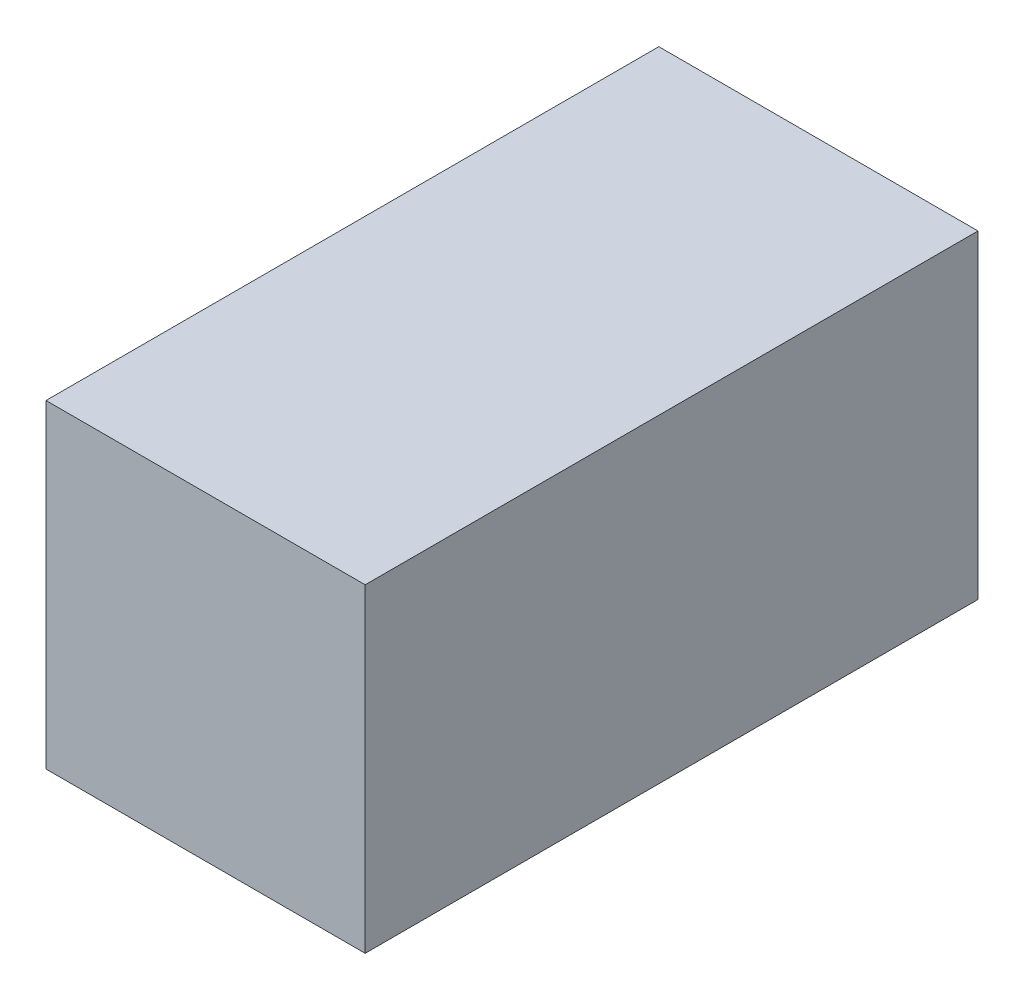
ISO-10303-21;
HEADER;
FILE_DESCRIPTION(('STEP AP214'),'2;1');
FILE_NAME('part.step','',(''),(''),'','','');
FILE_SCHEMA(('AUTOMOTIVE_DESIGN { 1 0 10303 214 1 1 1 1 }'));
ENDSEC;
DATA;
#1=APPLICATION_CONTEXT('core data for automotive mechanical design processes');
#2=APPLICATION_PROTOCOL_DEFINITION('international standard','automotive_design',2000,#1);
#3=PRODUCT_CONTEXT('',#1,'mechanical');
#4=PRODUCT('Part','Part','',(#3));
#5=PRODUCT_RELATED_PRODUCT_CATEGORY('part','',(#4));
#6=PRODUCT_DEFINITION_FORMATION('','',#4);
#7=PRODUCT_DEFINITION_CONTEXT('part definition',#1,'design');
#8=PRODUCT_DEFINITION('design','',#6,#7);
#9=PRODUCT_DEFINITION_SHAPE('','',#8);
#10=(LENGTH_UNIT() NAMED_UNIT(*) SI_UNIT(.MILLI.,.METRE.));
#11=(NAMED_UNIT(*) PLANE_ANGLE_UNIT() SI_UNIT($,.RADIAN.));
#12=(NAMED_UNIT(*) SI_UNIT($,.STERADIAN.) SOLID_ANGLE_UNIT());
#13=UNCERTAINTY_MEASURE_WITH_UNIT(LENGTH_MEASURE(1.E-05),#10,'distance_accuracy_value','');
#14=(GEOMETRIC_REPRESENTATION_CONTEXT(3) GLOBAL_UNCERTAINTY_ASSIGNED_CONTEXT((#13)) GLOBAL_UNIT_ASSIGNED_CONTEXT((#10,
#11,#12)) REPRESENTATION_CONTEXT('',''));
#15=CARTESIAN_POINT('',(0.,0.,0.));
#16=DIRECTION('',(0.,0.,1.));
#17=DIRECTION('',(1.,0.,0.));
#18=AXIS2_PLACEMENT_3D('',#15,#16,#17);
#19=CARTESIAN_POINT('',(-1.190625,1.190625,-4.572));
#20=DIRECTION('',(-1.,0.,0.));
#21=DIRECTION('',(0.,0.,1.));
#22=AXIS2_PLACEMENT_3D('',#19,#20,#21);
#23=PLANE('',#22);
#24=DIRECTION('',(0.,-1.,0.));
#25=VECTOR('',#24,1.);
#26=CARTESIAN_POINT('',(-1.190625,1.190625,0.));
#27=LINE('',#26,#25);
#28=CARTESIAN_POINT('',(-1.190625,1.190625,0.));
#29=VERTEX_POINT('',#28);
#30=CARTESIAN_POINT('',(-1.190625,-1.190625,0.));
#31=VERTEX_POINT('',#30);
#32=EDGE_CURVE('E98',#29,#31,#27,.T.);
#33=ORIENTED_EDGE('',*,*,#32,.F.);
#34=DIRECTION('',(0.,0.,1.));
#35=VECTOR('',#34,1.);
#36=CARTESIAN_POINT('',(-1.190625,1.190625,-4.572));
#37=LINE('',#36,#35);
#38=CARTESIAN_POINT('',(-1.190625,1.190625,-4.572));
#39=VERTEX_POINT('',#38);
#40=EDGE_CURVE('E11',#39,#29,#37,.T.);
#41=ORIENTED_EDGE('',*,*,#40,.F.);
#42=DIRECTION('',(0.,-1.,0.));
#43=VECTOR('',#42,1.);
#44=CARTESIAN_POINT('',(-1.190625,1.190625,-4.572));
#45=LINE('',#44,#43);
#46=CARTESIAN_POINT('',(-1.190625,-1.190625,-4.572));
#47=VERTEX_POINT('',#46);
#48=EDGE_CURVE('E92',#39,#47,#45,.T.);
#49=ORIENTED_EDGE('',*,*,#48,.T.);
#50=DIRECTION('',(0.,0.,1.));
#51=VECTOR('',#50,1.);
#52=CARTESIAN_POINT('',(-1.190625,-1.190625,-4.572));
#53=LINE('',#52,#51);
#54=EDGE_CURVE('E37',#47,#31,#53,.T.);
#55=ORIENTED_EDGE('',*,*,#54,.T.);
#56=EDGE_LOOP('',(#33,#41,#49,#55));
#57=FACE_BOUND('',#56,.T.);
#58=ADVANCED_FACE('F34',(#57),#23,.T.);
#59=CARTESIAN_POINT('',(-1.190625,1.190625,-4.572));
#60=DIRECTION('',(0.,1.,0.));
#61=DIRECTION('',(0.,0.,1.));
#62=AXIS2_PLACEMENT_3D('',#59,#60,#61);
#63=PLANE('',#62);
#64=DIRECTION('',(-1.,0.,0.));
#65=VECTOR('',#64,1.);
#66=CARTESIAN_POINT('',(-1.190625,1.190625,0.));
#67=LINE('',#66,#65);
#68=CARTESIAN_POINT('',(1.190625,1.190625,0.));
#69=VERTEX_POINT('',#68);
#70=EDGE_CURVE('E94',#69,#29,#67,.T.);
#71=ORIENTED_EDGE('',*,*,#70,.F.);
#72=DIRECTION('',(0.,0.,1.));
#73=VECTOR('',#72,1.);
#74=CARTESIAN_POINT('',(1.190625,1.190625,-4.572));
#75=LINE('',#74,#73);
#76=CARTESIAN_POINT('',(1.190625,1.190625,-4.572));
#77=VERTEX_POINT('',#76);
#78=EDGE_CURVE('E43',#77,#69,#75,.T.);
#79=ORIENTED_EDGE('',*,*,#78,.F.);
#80=DIRECTION('',(-1.,0.,0.));
#81=VECTOR('',#80,1.);
#82=CARTESIAN_POINT('',(-1.190625,1.190625,-4.572));
#83=LINE('',#82,#81);
#84=EDGE_CURVE('E89',#77,#39,#83,.T.);
#85=ORIENTED_EDGE('',*,*,#84,.T.);
#86=ORIENTED_EDGE('',*,*,#40,.T.);
#87=EDGE_LOOP('',(#71,#79,#85,#86));
#88=FACE_BOUND('',#87,.T.);
#89=ADVANCED_FACE('F108',(#88),#63,.T.);
#90=CARTESIAN_POINT('',(1.190625,1.190625,-4.572));
#91=DIRECTION('',(1.,0.,0.));
#92=DIRECTION('',(0.,1.,0.));
#93=AXIS2_PLACEMENT_3D('',#90,#91,#92);
#94=PLANE('',#93);
#95=DIRECTION('',(0.,1.,0.));
#96=VECTOR('',#95,1.);
#97=CARTESIAN_POINT('',(1.190625,1.190625,0.));
#98=LINE('',#97,#96);
#99=CARTESIAN_POINT('',(1.190625,-1.190625,0.));
#100=VERTEX_POINT('',#99);
#101=EDGE_CURVE('E84',#100,#69,#98,.T.);
#102=ORIENTED_EDGE('',*,*,#101,.F.);
#103=DIRECTION('',(0.,0.,1.));
#104=VECTOR('',#103,1.);
#105=CARTESIAN_POINT('',(1.190625,-1.190625,-4.572));
#106=LINE('',#105,#104);
#107=CARTESIAN_POINT('',(1.190625,-1.190625,-4.572));
#108=VERTEX_POINT('',#107);
#109=EDGE_CURVE('E79',#108,#100,#106,.T.);
#110=ORIENTED_EDGE('',*,*,#109,.F.);
#111=DIRECTION('',(0.,1.,0.));
#112=VECTOR('',#111,1.);
#113=CARTESIAN_POINT('',(1.190625,1.190625,-4.572));
#114=LINE('',#113,#112);
#115=EDGE_CURVE('E82',#108,#77,#114,.T.);
#116=ORIENTED_EDGE('',*,*,#115,.T.);
#117=ORIENTED_EDGE('',*,*,#78,.T.);
#118=EDGE_LOOP('',(#102,#110,#116,#117));
#119=FACE_BOUND('',#118,.T.);
#120=ADVANCED_FACE('F81',(#119),#94,.T.);
#121=CARTESIAN_POINT('',(-1.190625,-1.190625,-4.572));
#122=DIRECTION('',(0.,-1.,0.));
#123=DIRECTION('',(0.,0.,-1.));
#124=AXIS2_PLACEMENT_3D('',#121,#122,#123);
#125=PLANE('',#124);
#126=DIRECTION('',(1.,0.,0.));
#127=VECTOR('',#126,1.);
#128=CARTESIAN_POINT('',(-1.190625,-1.190625,0.));
#129=LINE('',#128,#127);
#130=EDGE_CURVE('E101',#31,#100,#129,.T.);
#131=ORIENTED_EDGE('',*,*,#130,.F.);
#132=ORIENTED_EDGE('',*,*,#54,.F.);
#133=DIRECTION('',(1.,0.,0.));
#134=VECTOR('',#133,1.);
#135=CARTESIAN_POINT('',(-1.190625,-1.190625,-4.572));
#136=LINE('',#135,#134);
#137=EDGE_CURVE('E88',#47,#108,#136,.T.);
#138=ORIENTED_EDGE('',*,*,#137,.T.);
#139=ORIENTED_EDGE('',*,*,#109,.T.);
#140=EDGE_LOOP('',(#131,#132,#138,#139));
#141=FACE_BOUND('',#140,.T.);
#142=ADVANCED_FACE('F91',(#141),#125,.T.);
#143=CARTESIAN_POINT('',(-1.190625,-1.190625,-4.572));
#144=DIRECTION('',(0.,0.,1.));
#145=DIRECTION('',(1.,0.,0.));
#146=AXIS2_PLACEMENT_3D('',#143,#144,#145);
#147=PLANE('',#146);
#148=ORIENTED_EDGE('',*,*,#48,.F.);
#149=ORIENTED_EDGE('',*,*,#84,.F.);
#150=ORIENTED_EDGE('',*,*,#115,.F.);
#151=ORIENTED_EDGE('',*,*,#137,.F.);
#152=EDGE_LOOP('',(#148,#149,#150,#151));
#153=FACE_BOUND('',#152,.T.);
#154=ADVANCED_FACE('F87',(#153),#147,.F.);
#155=CARTESIAN_POINT('',(-1.190625,-1.190625,0.));
#156=DIRECTION('',(0.,0.,1.));
#157=DIRECTION('',(1.,0.,0.));
#158=AXIS2_PLACEMENT_3D('',#155,#156,#157);
#159=PLANE('',#158);
#160=ORIENTED_EDGE('',*,*,#32,.T.);
#161=ORIENTED_EDGE('',*,*,#130,.T.);
#162=ORIENTED_EDGE('',*,*,#101,.T.);
#163=ORIENTED_EDGE('',*,*,#70,.T.);
#164=EDGE_LOOP('',(#160,#161,#162,#163));
#165=FACE_BOUND('',#164,.T.);
#166=ADVANCED_FACE('F107',(#165),#159,.T.);
#167=CLOSED_SHELL('',(#58,#89,#120,#142,#154,#166));
#168=MANIFOLD_SOLID_BREP('B2',#167);
#169=ADVANCED_BREP_SHAPE_REPRESENTATION('',(#18,#168),#14);
#170=SHAPE_DEFINITION_REPRESENTATION(#9,#169);
ENDSEC;
END-ISO-10303-21;
